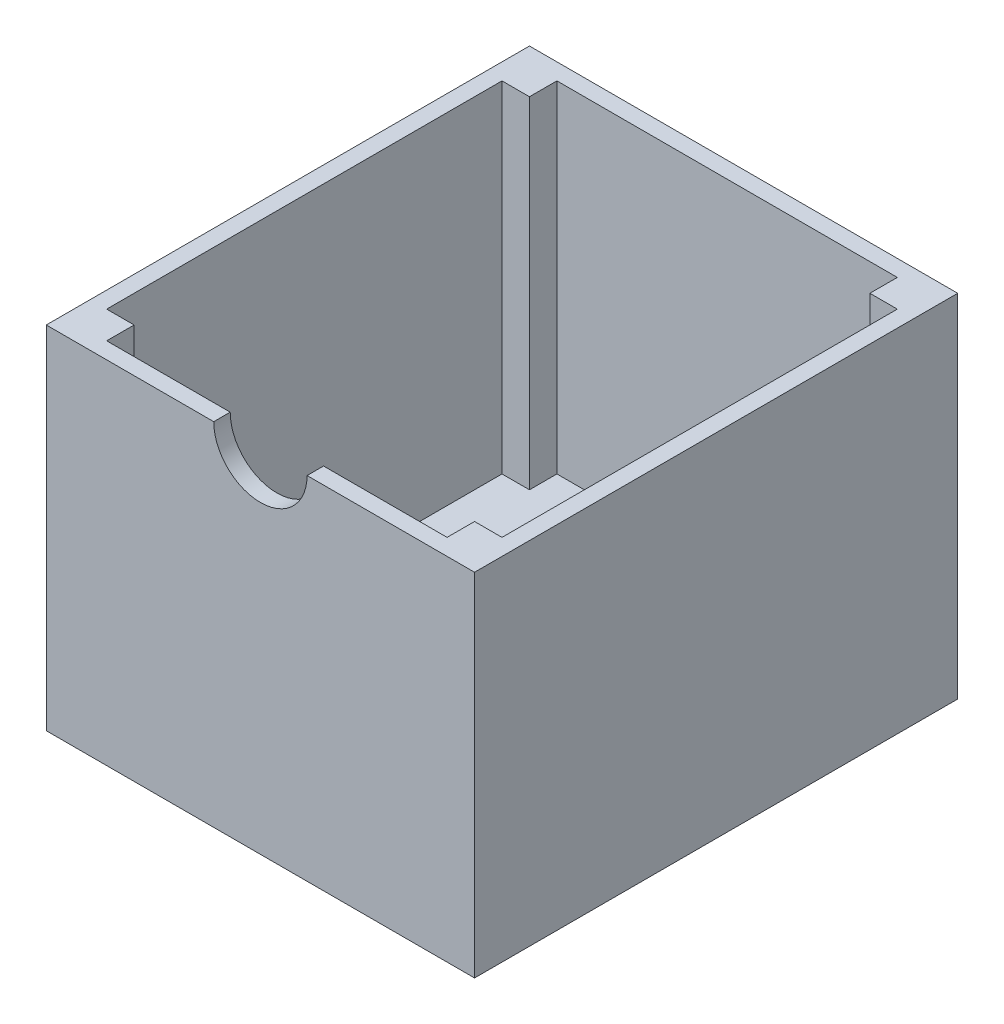
ISO-10303-21;
HEADER;
FILE_DESCRIPTION(('STEP AP214'),'2;1');
FILE_NAME('part.step','',(''),(''),'','','');
FILE_SCHEMA(('AUTOMOTIVE_DESIGN { 1 0 10303 214 1 1 1 1 }'));
ENDSEC;
DATA;
#1=APPLICATION_CONTEXT('core data for automotive mechanical design processes');
#2=APPLICATION_PROTOCOL_DEFINITION('international standard','automotive_design',2000,#1);
#3=PRODUCT_CONTEXT('',#1,'mechanical');
#4=PRODUCT('Part','Part','',(#3));
#5=PRODUCT_RELATED_PRODUCT_CATEGORY('part','',(#4));
#6=PRODUCT_DEFINITION_FORMATION('','',#4);
#7=PRODUCT_DEFINITION_CONTEXT('part definition',#1,'design');
#8=PRODUCT_DEFINITION('design','',#6,#7);
#9=PRODUCT_DEFINITION_SHAPE('','',#8);
#10=(LENGTH_UNIT() NAMED_UNIT(*) SI_UNIT(.MILLI.,.METRE.));
#11=(NAMED_UNIT(*) PLANE_ANGLE_UNIT() SI_UNIT($,.RADIAN.));
#12=(NAMED_UNIT(*) SI_UNIT($,.STERADIAN.) SOLID_ANGLE_UNIT());
#13=UNCERTAINTY_MEASURE_WITH_UNIT(LENGTH_MEASURE(1.E-05),#10,'distance_accuracy_value','');
#14=(GEOMETRIC_REPRESENTATION_CONTEXT(3) GLOBAL_UNCERTAINTY_ASSIGNED_CONTEXT((#13)) GLOBAL_UNIT_ASSIGNED_CONTEXT((#10,
#11,#12)) REPRESENTATION_CONTEXT('',''));
#15=CARTESIAN_POINT('',(0.,0.,0.));
#16=DIRECTION('',(0.,0.,1.));
#17=DIRECTION('',(1.,0.,0.));
#18=AXIS2_PLACEMENT_3D('',#15,#16,#17);
#19=CARTESIAN_POINT('',(0.,64.,-77.));
#20=DIRECTION('',(0.,0.,-1.));
#21=DIRECTION('',(-1.,0.,0.));
#22=AXIS2_PLACEMENT_3D('',#19,#20,#21);
#23=PLANE('',#22);
#24=DIRECTION('',(0.,-1.,0.));
#25=VECTOR('',#24,1.);
#26=CARTESIAN_POINT('',(67.,64.,-77.));
#27=LINE('',#26,#25);
#28=CARTESIAN_POINT('',(67.,64.,-77.));
#29=VERTEX_POINT('',#28);
#30=CARTESIAN_POINT('',(67.,2.,-77.));
#31=VERTEX_POINT('',#30);
#32=EDGE_CURVE('E208',#29,#31,#27,.T.);
#33=ORIENTED_EDGE('',*,*,#32,.T.);
#34=DIRECTION('',(1.,0.,0.));
#35=VECTOR('',#34,1.);
#36=CARTESIAN_POINT('',(0.,2.,-77.));
#37=LINE('',#36,#35);
#38=CARTESIAN_POINT('',(72.,2.,-77.));
#39=VERTEX_POINT('',#38);
#40=EDGE_CURVE('E295',#31,#39,#37,.T.);
#41=ORIENTED_EDGE('',*,*,#40,.T.);
#42=DIRECTION('',(0.,-1.,0.));
#43=VECTOR('',#42,1.);
#44=CARTESIAN_POINT('',(72.,64.,-77.));
#45=LINE('',#44,#43);
#46=CARTESIAN_POINT('',(72.,64.,-77.));
#47=VERTEX_POINT('',#46);
#48=EDGE_CURVE('E62',#47,#39,#45,.T.);
#49=ORIENTED_EDGE('',*,*,#48,.F.);
#50=DIRECTION('',(1.,0.,0.));
#51=VECTOR('',#50,1.);
#52=CARTESIAN_POINT('',(0.,64.,-77.));
#53=LINE('',#52,#51);
#54=EDGE_CURVE('E177',#29,#47,#53,.T.);
#55=ORIENTED_EDGE('',*,*,#54,.F.);
#56=EDGE_LOOP('',(#33,#41,#49,#55));
#57=FACE_BOUND('',#56,.T.);
#58=ADVANCED_FACE('F39',(#57),#23,.F.);
#59=CARTESIAN_POINT('',(67.,64.,0.));
#60=DIRECTION('',(1.,0.,0.));
#61=DIRECTION('',(0.,0.,-1.));
#62=AXIS2_PLACEMENT_3D('',#59,#60,#61);
#63=PLANE('',#62);
#64=DIRECTION('',(0.,-1.,0.));
#65=VECTOR('',#64,1.);
#66=CARTESIAN_POINT('',(67.,64.,-82.));
#67=LINE('',#66,#65);
#68=CARTESIAN_POINT('',(67.,64.,-82.));
#69=VERTEX_POINT('',#68);
#70=CARTESIAN_POINT('',(67.,2.,-82.));
#71=VERTEX_POINT('',#70);
#72=EDGE_CURVE('E212',#69,#71,#67,.T.);
#73=ORIENTED_EDGE('',*,*,#72,.T.);
#74=DIRECTION('',(0.,0.,1.));
#75=VECTOR('',#74,1.);
#76=CARTESIAN_POINT('',(67.,2.,0.));
#77=LINE('',#76,#75);
#78=EDGE_CURVE('E293',#71,#31,#77,.T.);
#79=ORIENTED_EDGE('',*,*,#78,.T.);
#80=ORIENTED_EDGE('',*,*,#32,.F.);
#81=DIRECTION('',(0.,0.,1.));
#82=VECTOR('',#81,1.);
#83=CARTESIAN_POINT('',(67.,64.,0.));
#84=LINE('',#83,#82);
#85=EDGE_CURVE('E205',#69,#29,#84,.T.);
#86=ORIENTED_EDGE('',*,*,#85,.F.);
#87=EDGE_LOOP('',(#73,#79,#80,#86));
#88=FACE_BOUND('',#87,.T.);
#89=ADVANCED_FACE('F348',(#88),#63,.F.);
#90=CARTESIAN_POINT('',(0.,64.,-82.));
#91=DIRECTION('',(0.,0.,-1.));
#92=DIRECTION('',(-1.,0.,0.));
#93=AXIS2_PLACEMENT_3D('',#90,#91,#92);
#94=PLANE('',#93);
#95=DIRECTION('',(0.,-1.,0.));
#96=VECTOR('',#95,1.);
#97=CARTESIAN_POINT('',(5.,64.,-82.));
#98=LINE('',#97,#96);
#99=CARTESIAN_POINT('',(5.,64.,-82.));
#100=VERTEX_POINT('',#99);
#101=CARTESIAN_POINT('',(5.,2.,-82.));
#102=VERTEX_POINT('',#101);
#103=EDGE_CURVE('E215',#100,#102,#98,.T.);
#104=ORIENTED_EDGE('',*,*,#103,.T.);
#105=DIRECTION('',(1.,0.,0.));
#106=VECTOR('',#105,1.);
#107=CARTESIAN_POINT('',(0.,2.,-82.));
#108=LINE('',#107,#106);
#109=EDGE_CURVE('E291',#102,#71,#108,.T.);
#110=ORIENTED_EDGE('',*,*,#109,.T.);
#111=ORIENTED_EDGE('',*,*,#72,.F.);
#112=DIRECTION('',(1.,0.,0.));
#113=VECTOR('',#112,1.);
#114=CARTESIAN_POINT('',(0.,64.,-82.));
#115=LINE('',#114,#113);
#116=EDGE_CURVE('E202',#100,#69,#115,.T.);
#117=ORIENTED_EDGE('',*,*,#116,.F.);
#118=EDGE_LOOP('',(#104,#110,#111,#117));
#119=FACE_BOUND('',#118,.T.);
#120=ADVANCED_FACE('F345',(#119),#94,.F.);
#121=CARTESIAN_POINT('',(5.00000000000001,64.,0.));
#122=DIRECTION('',(-1.,0.,0.));
#123=DIRECTION('',(0.,0.,1.));
#124=AXIS2_PLACEMENT_3D('',#121,#122,#123);
#125=PLANE('',#124);
#126=DIRECTION('',(0.,-1.,0.));
#127=VECTOR('',#126,1.);
#128=CARTESIAN_POINT('',(5.,64.,-77.));
#129=LINE('',#128,#127);
#130=CARTESIAN_POINT('',(5.,64.,-77.));
#131=VERTEX_POINT('',#130);
#132=CARTESIAN_POINT('',(5.,2.,-77.));
#133=VERTEX_POINT('',#132);
#134=EDGE_CURVE('E218',#131,#133,#129,.T.);
#135=ORIENTED_EDGE('',*,*,#134,.T.);
#136=DIRECTION('',(0.,0.,-1.));
#137=VECTOR('',#136,1.);
#138=CARTESIAN_POINT('',(5.00000000000001,2.,0.));
#139=LINE('',#138,#137);
#140=EDGE_CURVE('E289',#133,#102,#139,.T.);
#141=ORIENTED_EDGE('',*,*,#140,.T.);
#142=ORIENTED_EDGE('',*,*,#103,.F.);
#143=DIRECTION('',(0.,0.,-1.));
#144=VECTOR('',#143,1.);
#145=CARTESIAN_POINT('',(5.00000000000001,64.,0.));
#146=LINE('',#145,#144);
#147=EDGE_CURVE('E199',#131,#100,#146,.T.);
#148=ORIENTED_EDGE('',*,*,#147,.F.);
#149=EDGE_LOOP('',(#135,#141,#142,#148));
#150=FACE_BOUND('',#149,.T.);
#151=ADVANCED_FACE('F341',(#150),#125,.F.);
#152=CARTESIAN_POINT('',(0.,64.,-77.));
#153=DIRECTION('',(0.,0.,-1.));
#154=DIRECTION('',(-1.,0.,0.));
#155=AXIS2_PLACEMENT_3D('',#152,#153,#154);
#156=PLANE('',#155);
#157=DIRECTION('',(0.,-1.,0.));
#158=VECTOR('',#157,1.);
#159=CARTESIAN_POINT('',(0.,64.,-77.));
#160=LINE('',#159,#158);
#161=CARTESIAN_POINT('',(0.,64.,-77.));
#162=VERTEX_POINT('',#161);
#163=CARTESIAN_POINT('',(0.,2.,-77.));
#164=VERTEX_POINT('',#163);
#165=EDGE_CURVE('E221',#162,#164,#160,.T.);
#166=ORIENTED_EDGE('',*,*,#165,.T.);
#167=DIRECTION('',(1.,0.,0.));
#168=VECTOR('',#167,1.);
#169=CARTESIAN_POINT('',(0.,2.,-77.));
#170=LINE('',#169,#168);
#171=EDGE_CURVE('E287',#164,#133,#170,.T.);
#172=ORIENTED_EDGE('',*,*,#171,.T.);
#173=ORIENTED_EDGE('',*,*,#134,.F.);
#174=DIRECTION('',(1.,0.,0.));
#175=VECTOR('',#174,1.);
#176=CARTESIAN_POINT('',(0.,64.,-77.));
#177=LINE('',#176,#175);
#178=EDGE_CURVE('E196',#162,#131,#177,.T.);
#179=ORIENTED_EDGE('',*,*,#178,.F.);
#180=EDGE_LOOP('',(#166,#172,#173,#179));
#181=FACE_BOUND('',#180,.T.);
#182=ADVANCED_FACE('F337',(#181),#156,.F.);
#183=CARTESIAN_POINT('',(0.,64.,0.));
#184=DIRECTION('',(-1.,0.,0.));
#185=DIRECTION('',(0.,0.,1.));
#186=AXIS2_PLACEMENT_3D('',#183,#184,#185);
#187=PLANE('',#186);
#188=DIRECTION('',(0.,-1.,0.));
#189=VECTOR('',#188,1.);
#190=CARTESIAN_POINT('',(0.,64.,-4.99999999999998));
#191=LINE('',#190,#189);
#192=CARTESIAN_POINT('',(0.,64.,-4.99999999999998));
#193=VERTEX_POINT('',#192);
#194=CARTESIAN_POINT('',(0.,2.,-4.99999999999998));
#195=VERTEX_POINT('',#194);
#196=EDGE_CURVE('E224',#193,#195,#191,.T.);
#197=ORIENTED_EDGE('',*,*,#196,.T.);
#198=DIRECTION('',(0.,0.,-1.));
#199=VECTOR('',#198,1.);
#200=CARTESIAN_POINT('',(0.,2.,0.));
#201=LINE('',#200,#199);
#202=EDGE_CURVE('E285',#195,#164,#201,.T.);
#203=ORIENTED_EDGE('',*,*,#202,.T.);
#204=ORIENTED_EDGE('',*,*,#165,.F.);
#205=DIRECTION('',(0.,0.,-1.));
#206=VECTOR('',#205,1.);
#207=CARTESIAN_POINT('',(0.,64.,0.));
#208=LINE('',#207,#206);
#209=EDGE_CURVE('E193',#193,#162,#208,.T.);
#210=ORIENTED_EDGE('',*,*,#209,.F.);
#211=EDGE_LOOP('',(#197,#203,#204,#210));
#212=FACE_BOUND('',#211,.T.);
#213=ADVANCED_FACE('F334',(#212),#187,.F.);
#214=CARTESIAN_POINT('',(0.,64.,-4.99999999999998));
#215=DIRECTION('',(0.,0.,1.));
#216=DIRECTION('',(1.,0.,0.));
#217=AXIS2_PLACEMENT_3D('',#214,#215,#216);
#218=PLANE('',#217);
#219=DIRECTION('',(0.,-1.,0.));
#220=VECTOR('',#219,1.);
#221=CARTESIAN_POINT('',(5.,64.,-4.99999999999998));
#222=LINE('',#221,#220);
#223=CARTESIAN_POINT('',(5.,64.,-4.99999999999998));
#224=VERTEX_POINT('',#223);
#225=CARTESIAN_POINT('',(5.,2.,-4.99999999999998));
#226=VERTEX_POINT('',#225);
#227=EDGE_CURVE('E227',#224,#226,#222,.T.);
#228=ORIENTED_EDGE('',*,*,#227,.T.);
#229=DIRECTION('',(-1.,0.,0.));
#230=VECTOR('',#229,1.);
#231=CARTESIAN_POINT('',(0.,2.,-4.99999999999998));
#232=LINE('',#231,#230);
#233=EDGE_CURVE('E283',#226,#195,#232,.T.);
#234=ORIENTED_EDGE('',*,*,#233,.T.);
#235=ORIENTED_EDGE('',*,*,#196,.F.);
#236=DIRECTION('',(-1.,0.,0.));
#237=VECTOR('',#236,1.);
#238=CARTESIAN_POINT('',(0.,64.,-4.99999999999998));
#239=LINE('',#238,#237);
#240=EDGE_CURVE('E186',#224,#193,#239,.T.);
#241=ORIENTED_EDGE('',*,*,#240,.F.);
#242=EDGE_LOOP('',(#228,#234,#235,#241));
#243=FACE_BOUND('',#242,.T.);
#244=ADVANCED_FACE('F330',(#243),#218,.F.);
#245=CARTESIAN_POINT('',(5.,64.,0.));
#246=DIRECTION('',(-1.,0.,0.));
#247=DIRECTION('',(0.,0.,1.));
#248=AXIS2_PLACEMENT_3D('',#245,#246,#247);
#249=PLANE('',#248);
#250=DIRECTION('',(0.,-1.,0.));
#251=VECTOR('',#250,1.);
#252=CARTESIAN_POINT('',(5.,64.,0.));
#253=LINE('',#252,#251);
#254=CARTESIAN_POINT('',(5.,64.,0.));
#255=VERTEX_POINT('',#254);
#256=CARTESIAN_POINT('',(5.,2.,0.));
#257=VERTEX_POINT('',#256);
#258=EDGE_CURVE('E230',#255,#257,#253,.T.);
#259=ORIENTED_EDGE('',*,*,#258,.T.);
#260=DIRECTION('',(0.,0.,-1.));
#261=VECTOR('',#260,1.);
#262=CARTESIAN_POINT('',(5.,2.,0.));
#263=LINE('',#262,#261);
#264=EDGE_CURVE('E281',#257,#226,#263,.T.);
#265=ORIENTED_EDGE('',*,*,#264,.T.);
#266=ORIENTED_EDGE('',*,*,#227,.F.);
#267=DIRECTION('',(0.,0.,-1.));
#268=VECTOR('',#267,1.);
#269=CARTESIAN_POINT('',(5.,64.,0.));
#270=LINE('',#269,#268);
#271=EDGE_CURVE('E183',#255,#224,#270,.T.);
#272=ORIENTED_EDGE('',*,*,#271,.F.);
#273=EDGE_LOOP('',(#259,#265,#266,#272));
#274=FACE_BOUND('',#273,.T.);
#275=ADVANCED_FACE('F326',(#274),#249,.F.);
#276=CARTESIAN_POINT('',(0.,64.,0.));
#277=DIRECTION('',(0.,0.,1.));
#278=DIRECTION('',(1.,0.,0.));
#279=AXIS2_PLACEMENT_3D('',#276,#277,#278);
#280=PLANE('',#279);
#281=DIRECTION('',(-1.,0.,0.));
#282=VECTOR('',#281,1.);
#283=CARTESIAN_POINT('',(0.,64.,0.));
#284=LINE('',#283,#282);
#285=CARTESIAN_POINT('',(27.5,64.,0.));
#286=VERTEX_POINT('',#285);
#287=EDGE_CURVE('E176',#286,#255,#284,.T.);
#288=ORIENTED_EDGE('',*,*,#287,.F.);
#289=CARTESIAN_POINT('',(36.,64.,0.));
#290=DIRECTION('',(0.,0.,1.));
#291=DIRECTION('',(1.,0.,0.));
#292=AXIS2_PLACEMENT_3D('',#289,#290,#291);
#293=CIRCLE('',#292,8.50000000000001);
#294=CARTESIAN_POINT('',(44.5,64.,0.));
#295=VERTEX_POINT('',#294);
#296=EDGE_CURVE('E54',#295,#286,#293,.F.);
#297=ORIENTED_EDGE('',*,*,#296,.F.);
#298=CARTESIAN_POINT('',(67.,64.,0.));
#299=VERTEX_POINT('',#298);
#300=EDGE_CURVE('E173',#299,#295,#284,.T.);
#301=ORIENTED_EDGE('',*,*,#300,.F.);
#302=DIRECTION('',(0.,-1.,0.));
#303=VECTOR('',#302,1.);
#304=CARTESIAN_POINT('',(67.,64.,0.));
#305=LINE('',#304,#303);
#306=CARTESIAN_POINT('',(67.,2.,0.));
#307=VERTEX_POINT('',#306);
#308=EDGE_CURVE('E233',#299,#307,#305,.T.);
#309=ORIENTED_EDGE('',*,*,#308,.T.);
#310=DIRECTION('',(-1.,0.,0.));
#311=VECTOR('',#310,1.);
#312=CARTESIAN_POINT('',(0.,2.,0.));
#313=LINE('',#312,#311);
#314=EDGE_CURVE('E279',#307,#257,#313,.T.);
#315=ORIENTED_EDGE('',*,*,#314,.T.);
#316=ORIENTED_EDGE('',*,*,#258,.F.);
#317=EDGE_LOOP('',(#288,#297,#301,#309,#315,#316));
#318=FACE_BOUND('',#317,.T.);
#319=ADVANCED_FACE('F171',(#318),#280,.F.);
#320=CARTESIAN_POINT('',(67.,64.,0.));
#321=DIRECTION('',(1.,0.,0.));
#322=DIRECTION('',(0.,0.,-1.));
#323=AXIS2_PLACEMENT_3D('',#320,#321,#322);
#324=PLANE('',#323);
#325=DIRECTION('',(0.,-1.,0.));
#326=VECTOR('',#325,1.);
#327=CARTESIAN_POINT('',(67.,64.,-5.));
#328=LINE('',#327,#326);
#329=CARTESIAN_POINT('',(67.,64.,-5.));
#330=VERTEX_POINT('',#329);
#331=CARTESIAN_POINT('',(67.,2.,-5.));
#332=VERTEX_POINT('',#331);
#333=EDGE_CURVE('E235',#330,#332,#328,.T.);
#334=ORIENTED_EDGE('',*,*,#333,.T.);
#335=DIRECTION('',(0.,0.,1.));
#336=VECTOR('',#335,1.);
#337=CARTESIAN_POINT('',(67.,2.,0.));
#338=LINE('',#337,#336);
#339=EDGE_CURVE('E277',#332,#307,#338,.T.);
#340=ORIENTED_EDGE('',*,*,#339,.T.);
#341=ORIENTED_EDGE('',*,*,#308,.F.);
#342=DIRECTION('',(0.,0.,1.));
#343=VECTOR('',#342,1.);
#344=CARTESIAN_POINT('',(67.,64.,0.));
#345=LINE('',#344,#343);
#346=EDGE_CURVE('E182',#330,#299,#345,.T.);
#347=ORIENTED_EDGE('',*,*,#346,.F.);
#348=EDGE_LOOP('',(#334,#340,#341,#347));
#349=FACE_BOUND('',#348,.T.);
#350=ADVANCED_FACE('F321',(#349),#324,.F.);
#351=CARTESIAN_POINT('',(0.,64.,-5.));
#352=DIRECTION('',(0.,0.,1.));
#353=DIRECTION('',(1.,0.,0.));
#354=AXIS2_PLACEMENT_3D('',#351,#352,#353);
#355=PLANE('',#354);
#356=DIRECTION('',(0.,-1.,0.));
#357=VECTOR('',#356,1.);
#358=CARTESIAN_POINT('',(72.,64.,-5.));
#359=LINE('',#358,#357);
#360=CARTESIAN_POINT('',(72.,64.,-5.));
#361=VERTEX_POINT('',#360);
#362=CARTESIAN_POINT('',(72.,2.,-5.));
#363=VERTEX_POINT('',#362);
#364=EDGE_CURVE('E238',#361,#363,#359,.T.);
#365=ORIENTED_EDGE('',*,*,#364,.T.);
#366=DIRECTION('',(-1.,0.,0.));
#367=VECTOR('',#366,1.);
#368=CARTESIAN_POINT('',(0.,2.,-5.));
#369=LINE('',#368,#367);
#370=EDGE_CURVE('E275',#363,#332,#369,.T.);
#371=ORIENTED_EDGE('',*,*,#370,.T.);
#372=ORIENTED_EDGE('',*,*,#333,.F.);
#373=DIRECTION('',(-1.,0.,0.));
#374=VECTOR('',#373,1.);
#375=CARTESIAN_POINT('',(0.,64.,-5.));
#376=LINE('',#375,#374);
#377=EDGE_CURVE('E307',#361,#330,#376,.T.);
#378=ORIENTED_EDGE('',*,*,#377,.F.);
#379=EDGE_LOOP('',(#365,#371,#372,#378));
#380=FACE_BOUND('',#379,.T.);
#381=ADVANCED_FACE('F310',(#380),#355,.F.);
#382=CARTESIAN_POINT('',(72.,64.,0.));
#383=DIRECTION('',(1.,0.,0.));
#384=DIRECTION('',(0.,0.,-1.));
#385=AXIS2_PLACEMENT_3D('',#382,#383,#384);
#386=PLANE('',#385);
#387=ORIENTED_EDGE('',*,*,#48,.T.);
#388=DIRECTION('',(0.,0.,1.));
#389=VECTOR('',#388,1.);
#390=CARTESIAN_POINT('',(72.,2.,0.));
#391=LINE('',#390,#389);
#392=EDGE_CURVE('E268',#39,#363,#391,.T.);
#393=ORIENTED_EDGE('',*,*,#392,.T.);
#394=ORIENTED_EDGE('',*,*,#364,.F.);
#395=DIRECTION('',(0.,0.,1.));
#396=VECTOR('',#395,1.);
#397=CARTESIAN_POINT('',(72.,64.,0.));
#398=LINE('',#397,#396);
#399=EDGE_CURVE('E305',#47,#361,#398,.T.);
#400=ORIENTED_EDGE('',*,*,#399,.F.);
#401=EDGE_LOOP('',(#387,#393,#394,#400));
#402=FACE_BOUND('',#401,.T.);
#403=ADVANCED_FACE('F312',(#402),#386,.F.);
#404=CARTESIAN_POINT('',(75.,64.,0.));
#405=DIRECTION('',(1.,0.,0.));
#406=DIRECTION('',(0.,0.,-1.));
#407=AXIS2_PLACEMENT_3D('',#404,#405,#406);
#408=PLANE('',#407);
#409=DIRECTION('',(0.,0.,1.));
#410=VECTOR('',#409,1.);
#411=CARTESIAN_POINT('',(75.,0.,0.));
#412=LINE('',#411,#410);
#413=CARTESIAN_POINT('',(75.,0.,-85.));
#414=VERTEX_POINT('',#413);
#415=CARTESIAN_POINT('',(75.,0.,3.));
#416=VERTEX_POINT('',#415);
#417=EDGE_CURVE('E211',#414,#416,#412,.T.);
#418=ORIENTED_EDGE('',*,*,#417,.F.);
#419=DIRECTION('',(0.,-1.,0.));
#420=VECTOR('',#419,1.);
#421=CARTESIAN_POINT('',(75.,64.,-85.));
#422=LINE('',#421,#420);
#423=CARTESIAN_POINT('',(75.,64.,-85.));
#424=VERTEX_POINT('',#423);
#425=EDGE_CURVE('E266',#424,#414,#422,.T.);
#426=ORIENTED_EDGE('',*,*,#425,.F.);
#427=DIRECTION('',(0.,0.,1.));
#428=VECTOR('',#427,1.);
#429=CARTESIAN_POINT('',(75.,64.,0.));
#430=LINE('',#429,#428);
#431=CARTESIAN_POINT('',(75.,64.,3.));
#432=VERTEX_POINT('',#431);
#433=EDGE_CURVE('E242',#424,#432,#430,.T.);
#434=ORIENTED_EDGE('',*,*,#433,.T.);
#435=DIRECTION('',(0.,-1.,0.));
#436=VECTOR('',#435,1.);
#437=CARTESIAN_POINT('',(75.,64.,3.));
#438=LINE('',#437,#436);
#439=EDGE_CURVE('E255',#432,#416,#438,.T.);
#440=ORIENTED_EDGE('',*,*,#439,.T.);
#441=EDGE_LOOP('',(#418,#426,#434,#440));
#442=FACE_BOUND('',#441,.T.);
#443=ADVANCED_FACE('F366',(#442),#408,.T.);
#444=CARTESIAN_POINT('',(0.,64.,-85.));
#445=DIRECTION('',(0.,0.,-1.));
#446=DIRECTION('',(-1.,0.,0.));
#447=AXIS2_PLACEMENT_3D('',#444,#445,#446);
#448=PLANE('',#447);
#449=DIRECTION('',(1.,0.,0.));
#450=VECTOR('',#449,1.);
#451=CARTESIAN_POINT('',(0.,0.,-85.));
#452=LINE('',#451,#450);
#453=CARTESIAN_POINT('',(-3.,0.,-85.));
#454=VERTEX_POINT('',#453);
#455=EDGE_CURVE('E246',#454,#414,#452,.T.);
#456=ORIENTED_EDGE('',*,*,#455,.F.);
#457=DIRECTION('',(0.,-1.,0.));
#458=VECTOR('',#457,1.);
#459=CARTESIAN_POINT('',(-3.,64.,-85.));
#460=LINE('',#459,#458);
#461=CARTESIAN_POINT('',(-3.,64.,-85.));
#462=VERTEX_POINT('',#461);
#463=EDGE_CURVE('E269',#462,#454,#460,.T.);
#464=ORIENTED_EDGE('',*,*,#463,.F.);
#465=DIRECTION('',(1.,0.,0.));
#466=VECTOR('',#465,1.);
#467=CARTESIAN_POINT('',(0.,64.,-85.));
#468=LINE('',#467,#466);
#469=EDGE_CURVE('E252',#462,#424,#468,.T.);
#470=ORIENTED_EDGE('',*,*,#469,.T.);
#471=ORIENTED_EDGE('',*,*,#425,.T.);
#472=EDGE_LOOP('',(#456,#464,#470,#471));
#473=FACE_BOUND('',#472,.T.);
#474=ADVANCED_FACE('F362',(#473),#448,.T.);
#475=CARTESIAN_POINT('',(-3.,64.,0.));
#476=DIRECTION('',(-1.,0.,0.));
#477=DIRECTION('',(0.,0.,1.));
#478=AXIS2_PLACEMENT_3D('',#475,#476,#477);
#479=PLANE('',#478);
#480=DIRECTION('',(0.,0.,-1.));
#481=VECTOR('',#480,1.);
#482=CARTESIAN_POINT('',(-3.,0.,0.));
#483=LINE('',#482,#481);
#484=CARTESIAN_POINT('',(-3.,0.,3.));
#485=VERTEX_POINT('',#484);
#486=EDGE_CURVE('E261',#485,#454,#483,.T.);
#487=ORIENTED_EDGE('',*,*,#486,.F.);
#488=DIRECTION('',(0.,-1.,0.));
#489=VECTOR('',#488,1.);
#490=CARTESIAN_POINT('',(-3.,64.,3.));
#491=LINE('',#490,#489);
#492=CARTESIAN_POINT('',(-3.,64.,3.));
#493=VERTEX_POINT('',#492);
#494=EDGE_CURVE('E271',#493,#485,#491,.T.);
#495=ORIENTED_EDGE('',*,*,#494,.F.);
#496=DIRECTION('',(0.,0.,-1.));
#497=VECTOR('',#496,1.);
#498=CARTESIAN_POINT('',(-3.,64.,0.));
#499=LINE('',#498,#497);
#500=EDGE_CURVE('E249',#493,#462,#499,.T.);
#501=ORIENTED_EDGE('',*,*,#500,.T.);
#502=ORIENTED_EDGE('',*,*,#463,.T.);
#503=EDGE_LOOP('',(#487,#495,#501,#502));
#504=FACE_BOUND('',#503,.T.);
#505=ADVANCED_FACE('F365',(#504),#479,.T.);
#506=CARTESIAN_POINT('',(0.,64.,3.));
#507=DIRECTION('',(0.,0.,1.));
#508=DIRECTION('',(1.,0.,0.));
#509=AXIS2_PLACEMENT_3D('',#506,#507,#508);
#510=PLANE('',#509);
#511=CARTESIAN_POINT('',(36.,64.,3.));
#512=DIRECTION('',(0.,0.,1.));
#513=DIRECTION('',(1.,0.,0.));
#514=AXIS2_PLACEMENT_3D('',#511,#512,#513);
#515=CIRCLE('',#514,8.50000000000001);
#516=CARTESIAN_POINT('',(27.5,64.,3.));
#517=VERTEX_POINT('',#516);
#518=CARTESIAN_POINT('',(44.5,64.,3.));
#519=VERTEX_POINT('',#518);
#520=EDGE_CURVE('E163',#517,#519,#515,.T.);
#521=ORIENTED_EDGE('',*,*,#520,.F.);
#522=DIRECTION('',(-1.,0.,0.));
#523=VECTOR('',#522,1.);
#524=CARTESIAN_POINT('',(0.,64.,3.));
#525=LINE('',#524,#523);
#526=EDGE_CURVE('E245',#517,#493,#525,.T.);
#527=ORIENTED_EDGE('',*,*,#526,.T.);
#528=ORIENTED_EDGE('',*,*,#494,.T.);
#529=DIRECTION('',(-1.,0.,0.));
#530=VECTOR('',#529,1.);
#531=CARTESIAN_POINT('',(0.,0.,3.));
#532=LINE('',#531,#530);
#533=EDGE_CURVE('E258',#416,#485,#532,.T.);
#534=ORIENTED_EDGE('',*,*,#533,.F.);
#535=ORIENTED_EDGE('',*,*,#439,.F.);
#536=EDGE_CURVE('E247',#432,#519,#525,.T.);
#537=ORIENTED_EDGE('',*,*,#536,.T.);
#538=EDGE_LOOP('',(#521,#527,#528,#534,#535,#537));
#539=FACE_BOUND('',#538,.T.);
#540=ADVANCED_FACE('F299',(#539),#510,.T.);
#541=CARTESIAN_POINT('',(0.,64.,0.));
#542=DIRECTION('',(0.,-1.,0.));
#543=DIRECTION('',(0.,0.,-1.));
#544=AXIS2_PLACEMENT_3D('',#541,#542,#543);
#545=PLANE('',#544);
#546=ORIENTED_EDGE('',*,*,#300,.T.);
#547=DIRECTION('',(0.,0.,1.));
#548=VECTOR('',#547,1.);
#549=CARTESIAN_POINT('',(44.5,64.,-24.0416305603426));
#550=LINE('',#549,#548);
#551=EDGE_CURVE('E11',#295,#519,#550,.T.);
#552=ORIENTED_EDGE('',*,*,#551,.T.);
#553=ORIENTED_EDGE('',*,*,#536,.F.);
#554=ORIENTED_EDGE('',*,*,#433,.F.);
#555=ORIENTED_EDGE('',*,*,#469,.F.);
#556=ORIENTED_EDGE('',*,*,#500,.F.);
#557=ORIENTED_EDGE('',*,*,#526,.F.);
#558=DIRECTION('',(0.,0.,1.));
#559=VECTOR('',#558,1.);
#560=CARTESIAN_POINT('',(27.5,64.,-24.0416305603426));
#561=LINE('',#560,#559);
#562=EDGE_CURVE('E47',#517,#286,#561,.F.);
#563=ORIENTED_EDGE('',*,*,#562,.T.);
#564=ORIENTED_EDGE('',*,*,#287,.T.);
#565=ORIENTED_EDGE('',*,*,#271,.T.);
#566=ORIENTED_EDGE('',*,*,#240,.T.);
#567=ORIENTED_EDGE('',*,*,#209,.T.);
#568=ORIENTED_EDGE('',*,*,#178,.T.);
#569=ORIENTED_EDGE('',*,*,#147,.T.);
#570=ORIENTED_EDGE('',*,*,#116,.T.);
#571=ORIENTED_EDGE('',*,*,#85,.T.);
#572=ORIENTED_EDGE('',*,*,#54,.T.);
#573=ORIENTED_EDGE('',*,*,#399,.T.);
#574=ORIENTED_EDGE('',*,*,#377,.T.);
#575=ORIENTED_EDGE('',*,*,#346,.T.);
#576=EDGE_LOOP('',(#546,#552,#553,#554,#555,#556,#557,#563,#564,#565,#566,#567,#568,#569,#570,
#571,#572,#573,#574,#575));
#577=FACE_BOUND('',#576,.T.);
#578=ADVANCED_FACE('F179',(#577),#545,.F.);
#579=CARTESIAN_POINT('',(0.,0.,0.));
#580=DIRECTION('',(0.,-1.,0.));
#581=DIRECTION('',(0.,0.,-1.));
#582=AXIS2_PLACEMENT_3D('',#579,#580,#581);
#583=PLANE('',#582);
#584=ORIENTED_EDGE('',*,*,#417,.T.);
#585=ORIENTED_EDGE('',*,*,#533,.T.);
#586=ORIENTED_EDGE('',*,*,#486,.T.);
#587=ORIENTED_EDGE('',*,*,#455,.T.);
#588=EDGE_LOOP('',(#584,#585,#586,#587));
#589=FACE_BOUND('',#588,.T.);
#590=ADVANCED_FACE('F41',(#589),#583,.T.);
#591=CARTESIAN_POINT('',(0.,2.,0.));
#592=DIRECTION('',(0.,-1.,0.));
#593=DIRECTION('',(0.,0.,-1.));
#594=AXIS2_PLACEMENT_3D('',#591,#592,#593);
#595=PLANE('',#594);
#596=ORIENTED_EDGE('',*,*,#40,.F.);
#597=ORIENTED_EDGE('',*,*,#78,.F.);
#598=ORIENTED_EDGE('',*,*,#109,.F.);
#599=ORIENTED_EDGE('',*,*,#140,.F.);
#600=ORIENTED_EDGE('',*,*,#171,.F.);
#601=ORIENTED_EDGE('',*,*,#202,.F.);
#602=ORIENTED_EDGE('',*,*,#233,.F.);
#603=ORIENTED_EDGE('',*,*,#264,.F.);
#604=ORIENTED_EDGE('',*,*,#314,.F.);
#605=ORIENTED_EDGE('',*,*,#339,.F.);
#606=ORIENTED_EDGE('',*,*,#370,.F.);
#607=ORIENTED_EDGE('',*,*,#392,.F.);
#608=EDGE_LOOP('',(#596,#597,#598,#599,#600,#601,#602,#603,#604,#605,#606,#607));
#609=FACE_BOUND('',#608,.T.);
#610=ADVANCED_FACE('F316',(#609),#595,.F.);
#611=CARTESIAN_POINT('',(36.,64.,-24.0416305603426));
#612=DIRECTION('',(0.,0.,1.));
#613=DIRECTION('',(1.,0.,0.));
#614=AXIS2_PLACEMENT_3D('',#611,#612,#613);
#615=CYLINDRICAL_SURFACE('',#614,8.50000000000001);
#616=ORIENTED_EDGE('',*,*,#296,.T.);
#617=ORIENTED_EDGE('',*,*,#562,.F.);
#618=ORIENTED_EDGE('',*,*,#520,.T.);
#619=ORIENTED_EDGE('',*,*,#551,.F.);
#620=EDGE_LOOP('',(#616,#617,#618,#619));
#621=FACE_BOUND('',#620,.T.);
#622=ADVANCED_FACE('F161',(#621),#615,.F.);
#623=CLOSED_SHELL('',(#58,#89,#120,#151,#182,#213,#244,#275,#319,#350,#381,#403,#443,#474,#505,
#540,#578,#590,#610,#622));
#624=MANIFOLD_SOLID_BREP('B2',#623);
#625=ADVANCED_BREP_SHAPE_REPRESENTATION('',(#18,#624),#14);
#626=SHAPE_DEFINITION_REPRESENTATION(#9,#625);
ENDSEC;
END-ISO-10303-21;
